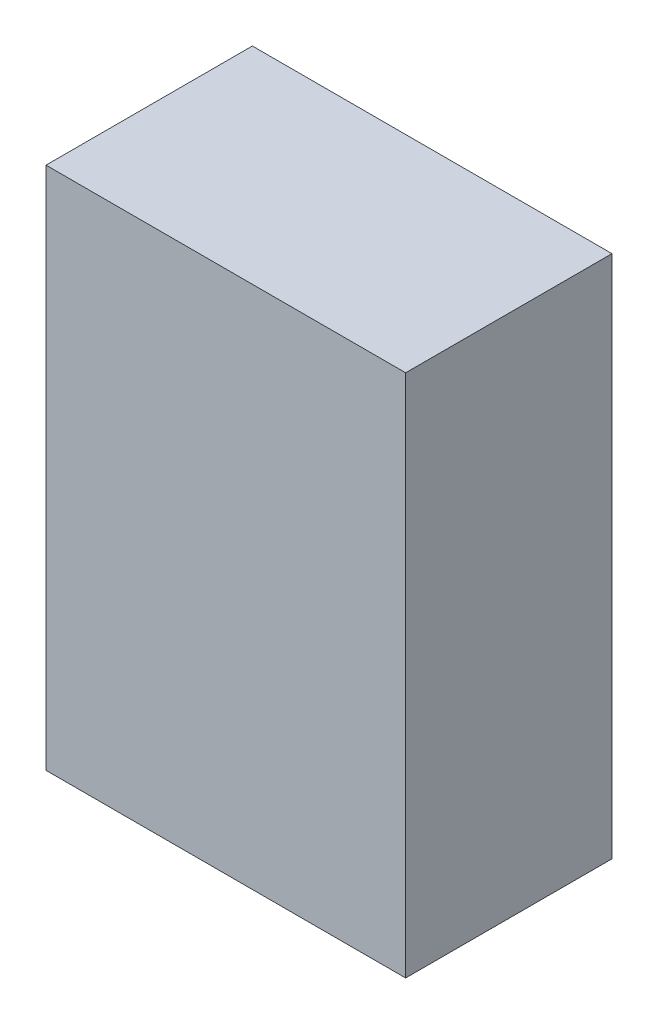
ISO-10303-21;
HEADER;
FILE_DESCRIPTION(('STEP AP214'),'2;1');
FILE_NAME('part.step','',(''),(''),'','','');
FILE_SCHEMA(('AUTOMOTIVE_DESIGN { 1 0 10303 214 1 1 1 1 }'));
ENDSEC;
DATA;
#1=APPLICATION_CONTEXT('core data for automotive mechanical design processes');
#2=APPLICATION_PROTOCOL_DEFINITION('international standard','automotive_design',2000,#1);
#3=PRODUCT_CONTEXT('',#1,'mechanical');
#4=PRODUCT('Part','Part','',(#3));
#5=PRODUCT_RELATED_PRODUCT_CATEGORY('part','',(#4));
#6=PRODUCT_DEFINITION_FORMATION('','',#4);
#7=PRODUCT_DEFINITION_CONTEXT('part definition',#1,'design');
#8=PRODUCT_DEFINITION('design','',#6,#7);
#9=PRODUCT_DEFINITION_SHAPE('','',#8);
#10=(LENGTH_UNIT() NAMED_UNIT(*) SI_UNIT(.MILLI.,.METRE.));
#11=(NAMED_UNIT(*) PLANE_ANGLE_UNIT() SI_UNIT($,.RADIAN.));
#12=(NAMED_UNIT(*) SI_UNIT($,.STERADIAN.) SOLID_ANGLE_UNIT());
#13=UNCERTAINTY_MEASURE_WITH_UNIT(LENGTH_MEASURE(1.E-05),#10,'distance_accuracy_value','');
#14=(GEOMETRIC_REPRESENTATION_CONTEXT(3) GLOBAL_UNCERTAINTY_ASSIGNED_CONTEXT((#13)) GLOBAL_UNIT_ASSIGNED_CONTEXT((#10,
#11,#12)) REPRESENTATION_CONTEXT('',''));
#15=CARTESIAN_POINT('',(0.,0.,0.));
#16=DIRECTION('',(0.,0.,1.));
#17=DIRECTION('',(1.,0.,0.));
#18=AXIS2_PLACEMENT_3D('',#15,#16,#17);
#19=CARTESIAN_POINT('',(29.785,9.,5.));
#20=DIRECTION('',(-1.,0.,0.));
#21=DIRECTION('',(0.,0.,1.));
#22=AXIS2_PLACEMENT_3D('',#19,#20,#21);
#23=PLANE('',#22);
#24=DIRECTION('',(0.,-1.,0.));
#25=VECTOR('',#24,1.);
#26=CARTESIAN_POINT('',(29.785,8.99999999999999,14.5));
#27=LINE('',#26,#25);
#28=CARTESIAN_POINT('',(29.785,1.50000000000001,14.5));
#29=VERTEX_POINT('',#28);
#30=CARTESIAN_POINT('',(29.785,0.,14.5));
#31=VERTEX_POINT('',#30);
#32=EDGE_CURVE('E56',#29,#31,#27,.T.);
#33=ORIENTED_EDGE('',*,*,#32,.F.);
#34=CARTESIAN_POINT('',(29.785,1.50000000000001,13.));
#35=DIRECTION('',(-1.,0.,0.));
#36=DIRECTION('',(0.,0.,1.));
#37=AXIS2_PLACEMENT_3D('',#34,#35,#36);
#38=CIRCLE('',#37,1.5);
#39=CARTESIAN_POINT('',(29.785,3.00000000000001,13.));
#40=VERTEX_POINT('',#39);
#41=EDGE_CURVE('E60',#40,#29,#38,.F.);
#42=ORIENTED_EDGE('',*,*,#41,.F.);
#43=DIRECTION('',(0.,0.,1.));
#44=VECTOR('',#43,1.);
#45=CARTESIAN_POINT('',(29.785,3.00000000000001,5.));
#46=LINE('',#45,#44);
#47=CARTESIAN_POINT('',(29.785,3.00000000000001,12.));
#48=VERTEX_POINT('',#47);
#49=EDGE_CURVE('E293',#48,#40,#46,.T.);
#50=ORIENTED_EDGE('',*,*,#49,.F.);
#51=CARTESIAN_POINT('',(29.785,1.50000000000001,12.));
#52=DIRECTION('',(-1.,0.,0.));
#53=DIRECTION('',(0.,0.,1.));
#54=AXIS2_PLACEMENT_3D('',#51,#52,#53);
#55=CIRCLE('',#54,1.5);
#56=CARTESIAN_POINT('',(29.785,1.50000000000001,10.5));
#57=VERTEX_POINT('',#56);
#58=EDGE_CURVE('E284',#57,#48,#55,.F.);
#59=ORIENTED_EDGE('',*,*,#58,.F.);
#60=DIRECTION('',(0.,1.,0.));
#61=VECTOR('',#60,1.);
#62=CARTESIAN_POINT('',(29.785,9.,10.5));
#63=LINE('',#62,#61);
#64=CARTESIAN_POINT('',(29.785,0.,10.5));
#65=VERTEX_POINT('',#64);
#66=EDGE_CURVE('E245',#65,#57,#63,.T.);
#67=ORIENTED_EDGE('',*,*,#66,.F.);
#68=DIRECTION('',(0.,0.,-1.));
#69=VECTOR('',#68,1.);
#70=CARTESIAN_POINT('',(29.785,0.,5.));
#71=LINE('',#70,#69);
#72=CARTESIAN_POINT('',(29.785,0.,7.5));
#73=VERTEX_POINT('',#72);
#74=EDGE_CURVE('E312',#65,#73,#71,.T.);
#75=ORIENTED_EDGE('',*,*,#74,.T.);
#76=DIRECTION('',(0.,1.,0.));
#77=VECTOR('',#76,1.);
#78=CARTESIAN_POINT('',(29.785,0.,7.5));
#79=LINE('',#78,#77);
#80=CARTESIAN_POINT('',(29.785,3.50000000000001,7.5));
#81=VERTEX_POINT('',#80);
#82=EDGE_CURVE('E414',#73,#81,#79,.T.);
#83=ORIENTED_EDGE('',*,*,#82,.T.);
#84=CARTESIAN_POINT('',(29.785,3.50000000000001,9.));
#85=DIRECTION('',(-1.,0.,0.));
#86=DIRECTION('',(0.,0.,1.));
#87=AXIS2_PLACEMENT_3D('',#84,#85,#86);
#88=CIRCLE('',#87,1.5);
#89=CARTESIAN_POINT('',(29.785,5.00000000000001,9.));
#90=VERTEX_POINT('',#89);
#91=EDGE_CURVE('E234',#81,#90,#88,.F.);
#92=ORIENTED_EDGE('',*,*,#91,.T.);
#93=DIRECTION('',(0.,0.,1.));
#94=VECTOR('',#93,1.);
#95=CARTESIAN_POINT('',(29.785,5.00000000000001,9.00000000000001));
#96=LINE('',#95,#94);
#97=CARTESIAN_POINT('',(29.785,5.00000000000001,16.));
#98=VERTEX_POINT('',#97);
#99=EDGE_CURVE('E319',#90,#98,#96,.T.);
#100=ORIENTED_EDGE('',*,*,#99,.T.);
#101=CARTESIAN_POINT('',(29.785,3.50000000000001,16.));
#102=DIRECTION('',(-1.,0.,0.));
#103=DIRECTION('',(0.,0.,1.));
#104=AXIS2_PLACEMENT_3D('',#101,#102,#103);
#105=CIRCLE('',#104,1.5);
#106=CARTESIAN_POINT('',(29.785,3.50000000000001,17.5));
#107=VERTEX_POINT('',#106);
#108=EDGE_CURVE('E322',#98,#107,#105,.F.);
#109=ORIENTED_EDGE('',*,*,#108,.T.);
#110=DIRECTION('',(0.,-1.,0.));
#111=VECTOR('',#110,1.);
#112=CARTESIAN_POINT('',(29.785,3.5,17.5));
#113=LINE('',#112,#111);
#114=CARTESIAN_POINT('',(29.785,0.,17.5));
#115=VERTEX_POINT('',#114);
#116=EDGE_CURVE('E325',#107,#115,#113,.T.);
#117=ORIENTED_EDGE('',*,*,#116,.T.);
#118=EDGE_CURVE('E313',#115,#31,#71,.T.);
#119=ORIENTED_EDGE('',*,*,#118,.T.);
#120=EDGE_LOOP('',(#33,#42,#50,#59,#67,#75,#83,#92,#100,#109,#117,#119));
#121=FACE_BOUND('',#120,.T.);
#122=ADVANCED_FACE('F41',(#121),#23,.F.);
#123=CARTESIAN_POINT('',(13.785,9.,5.));
#124=DIRECTION('',(1.,0.,0.));
#125=DIRECTION('',(0.,0.,-1.));
#126=AXIS2_PLACEMENT_3D('',#123,#124,#125);
#127=PLANE('',#126);
#128=DIRECTION('',(0.,1.,0.));
#129=VECTOR('',#128,1.);
#130=CARTESIAN_POINT('',(13.785,8.99999999999999,14.5));
#131=LINE('',#130,#129);
#132=CARTESIAN_POINT('',(13.785,0.,14.5));
#133=VERTEX_POINT('',#132);
#134=CARTESIAN_POINT('',(13.785,1.50000000000001,14.5));
#135=VERTEX_POINT('',#134);
#136=EDGE_CURVE('E305',#133,#135,#131,.T.);
#137=ORIENTED_EDGE('',*,*,#136,.F.);
#138=DIRECTION('',(0.,0.,1.));
#139=VECTOR('',#138,1.);
#140=CARTESIAN_POINT('',(13.785,0.,5.));
#141=LINE('',#140,#139);
#142=CARTESIAN_POINT('',(13.785,0.,17.5));
#143=VERTEX_POINT('',#142);
#144=EDGE_CURVE('E235',#133,#143,#141,.T.);
#145=ORIENTED_EDGE('',*,*,#144,.T.);
#146=DIRECTION('',(0.,1.,0.));
#147=VECTOR('',#146,1.);
#148=CARTESIAN_POINT('',(13.785,3.5,17.5));
#149=LINE('',#148,#147);
#150=CARTESIAN_POINT('',(13.785,3.5,17.5));
#151=VERTEX_POINT('',#150);
#152=EDGE_CURVE('E360',#143,#151,#149,.T.);
#153=ORIENTED_EDGE('',*,*,#152,.T.);
#154=CARTESIAN_POINT('',(13.785,3.5,16.));
#155=DIRECTION('',(1.,0.,0.));
#156=DIRECTION('',(0.,0.,-1.));
#157=AXIS2_PLACEMENT_3D('',#154,#155,#156);
#158=CIRCLE('',#157,1.5);
#159=CARTESIAN_POINT('',(13.785,5.,16.));
#160=VERTEX_POINT('',#159);
#161=EDGE_CURVE('E357',#151,#160,#158,.F.);
#162=ORIENTED_EDGE('',*,*,#161,.T.);
#163=DIRECTION('',(0.,0.,-1.));
#164=VECTOR('',#163,1.);
#165=CARTESIAN_POINT('',(13.785,5.,8.99999999999999));
#166=LINE('',#165,#164);
#167=CARTESIAN_POINT('',(13.785,5.,9.));
#168=VERTEX_POINT('',#167);
#169=EDGE_CURVE('E354',#160,#168,#166,.T.);
#170=ORIENTED_EDGE('',*,*,#169,.T.);
#171=CARTESIAN_POINT('',(13.785,3.5,9.));
#172=DIRECTION('',(1.,0.,0.));
#173=DIRECTION('',(0.,0.,-1.));
#174=AXIS2_PLACEMENT_3D('',#171,#172,#173);
#175=CIRCLE('',#174,1.5);
#176=CARTESIAN_POINT('',(13.785,3.5,7.5));
#177=VERTEX_POINT('',#176);
#178=EDGE_CURVE('E352',#168,#177,#175,.F.);
#179=ORIENTED_EDGE('',*,*,#178,.T.);
#180=DIRECTION('',(0.,-1.,0.));
#181=VECTOR('',#180,1.);
#182=CARTESIAN_POINT('',(13.785,0.,7.5));
#183=LINE('',#182,#181);
#184=CARTESIAN_POINT('',(13.785,0.,7.5));
#185=VERTEX_POINT('',#184);
#186=EDGE_CURVE('E230',#177,#185,#183,.T.);
#187=ORIENTED_EDGE('',*,*,#186,.T.);
#188=CARTESIAN_POINT('',(13.785,0.,10.5));
#189=VERTEX_POINT('',#188);
#190=EDGE_CURVE('E224',#185,#189,#141,.T.);
#191=ORIENTED_EDGE('',*,*,#190,.T.);
#192=DIRECTION('',(0.,-1.,0.));
#193=VECTOR('',#192,1.);
#194=CARTESIAN_POINT('',(13.785,9.,10.5));
#195=LINE('',#194,#193);
#196=CARTESIAN_POINT('',(13.785,1.50000000000001,10.5));
#197=VERTEX_POINT('',#196);
#198=EDGE_CURVE('E227',#197,#189,#195,.T.);
#199=ORIENTED_EDGE('',*,*,#198,.F.);
#200=CARTESIAN_POINT('',(13.785,1.5,12.));
#201=DIRECTION('',(1.,0.,0.));
#202=DIRECTION('',(0.,0.,-1.));
#203=AXIS2_PLACEMENT_3D('',#200,#201,#202);
#204=CIRCLE('',#203,1.5);
#205=CARTESIAN_POINT('',(13.785,3.,12.));
#206=VERTEX_POINT('',#205);
#207=EDGE_CURVE('E282',#206,#197,#204,.F.);
#208=ORIENTED_EDGE('',*,*,#207,.F.);
#209=DIRECTION('',(0.,0.,-1.));
#210=VECTOR('',#209,1.);
#211=CARTESIAN_POINT('',(13.785,3.,5.));
#212=LINE('',#211,#210);
#213=CARTESIAN_POINT('',(13.785,3.,13.));
#214=VERTEX_POINT('',#213);
#215=EDGE_CURVE('E290',#214,#206,#212,.T.);
#216=ORIENTED_EDGE('',*,*,#215,.F.);
#217=CARTESIAN_POINT('',(13.785,1.5,13.));
#218=DIRECTION('',(1.,0.,0.));
#219=DIRECTION('',(0.,0.,-1.));
#220=AXIS2_PLACEMENT_3D('',#217,#218,#219);
#221=CIRCLE('',#220,1.5);
#222=EDGE_CURVE('E298',#135,#214,#221,.F.);
#223=ORIENTED_EDGE('',*,*,#222,.F.);
#224=EDGE_LOOP('',(#137,#145,#153,#162,#170,#179,#187,#191,#199,#208,#216,#223));
#225=FACE_BOUND('',#224,.T.);
#226=ADVANCED_FACE('F226',(#225),#127,.F.);
#227=CARTESIAN_POINT('',(35.785,9.,20.));
#228=DIRECTION('',(1.,0.,0.));
#229=DIRECTION('',(0.,0.,-1.));
#230=AXIS2_PLACEMENT_3D('',#227,#228,#229);
#231=PLANE('',#230);
#232=DIRECTION('',(0.,1.,0.));
#233=VECTOR('',#232,1.);
#234=CARTESIAN_POINT('',(35.785,9.00000000000001,14.5));
#235=LINE('',#234,#233);
#236=CARTESIAN_POINT('',(35.785,0.,14.5));
#237=VERTEX_POINT('',#236);
#238=CARTESIAN_POINT('',(35.785,1.50000000000001,14.5));
#239=VERTEX_POINT('',#238);
#240=EDGE_CURVE('E302',#237,#239,#235,.T.);
#241=ORIENTED_EDGE('',*,*,#240,.F.);
#242=DIRECTION('',(0.,0.,1.));
#243=VECTOR('',#242,1.);
#244=CARTESIAN_POINT('',(35.785,0.,20.));
#245=LINE('',#244,#243);
#246=CARTESIAN_POINT('',(35.785,0.,17.5));
#247=VERTEX_POINT('',#246);
#248=EDGE_CURVE('E309',#237,#247,#245,.T.);
#249=ORIENTED_EDGE('',*,*,#248,.T.);
#250=DIRECTION('',(0.,1.,0.));
#251=VECTOR('',#250,1.);
#252=CARTESIAN_POINT('',(35.785,3.5,17.5));
#253=LINE('',#252,#251);
#254=CARTESIAN_POINT('',(35.785,3.50000000000001,17.5));
#255=VERTEX_POINT('',#254);
#256=EDGE_CURVE('E337',#247,#255,#253,.T.);
#257=ORIENTED_EDGE('',*,*,#256,.T.);
#258=CARTESIAN_POINT('',(35.785,3.50000000000001,16.));
#259=DIRECTION('',(1.,0.,0.));
#260=DIRECTION('',(0.,0.,-1.));
#261=AXIS2_PLACEMENT_3D('',#258,#259,#260);
#262=CIRCLE('',#261,1.5);
#263=CARTESIAN_POINT('',(35.785,5.00000000000001,16.));
#264=VERTEX_POINT('',#263);
#265=EDGE_CURVE('E334',#255,#264,#262,.F.);
#266=ORIENTED_EDGE('',*,*,#265,.T.);
#267=DIRECTION('',(0.,0.,-1.));
#268=VECTOR('',#267,1.);
#269=CARTESIAN_POINT('',(35.785,5.00000000000001,9.));
#270=LINE('',#269,#268);
#271=CARTESIAN_POINT('',(35.785,5.00000000000001,9.));
#272=VERTEX_POINT('',#271);
#273=EDGE_CURVE('E331',#264,#272,#270,.T.);
#274=ORIENTED_EDGE('',*,*,#273,.T.);
#275=CARTESIAN_POINT('',(35.785,3.50000000000001,9.));
#276=DIRECTION('',(1.,0.,0.));
#277=DIRECTION('',(0.,0.,-1.));
#278=AXIS2_PLACEMENT_3D('',#275,#276,#277);
#279=CIRCLE('',#278,1.5);
#280=CARTESIAN_POINT('',(35.785,3.50000000000001,7.5));
#281=VERTEX_POINT('',#280);
#282=EDGE_CURVE('E328',#272,#281,#279,.F.);
#283=ORIENTED_EDGE('',*,*,#282,.T.);
#284=DIRECTION('',(0.,-1.,0.));
#285=VECTOR('',#284,1.);
#286=CARTESIAN_POINT('',(35.785,0.,7.5));
#287=LINE('',#286,#285);
#288=CARTESIAN_POINT('',(35.785,0.,7.5));
#289=VERTEX_POINT('',#288);
#290=EDGE_CURVE('E417',#281,#289,#287,.T.);
#291=ORIENTED_EDGE('',*,*,#290,.T.);
#292=CARTESIAN_POINT('',(35.785,0.,10.5));
#293=VERTEX_POINT('',#292);
#294=EDGE_CURVE('E310',#289,#293,#245,.T.);
#295=ORIENTED_EDGE('',*,*,#294,.T.);
#296=DIRECTION('',(0.,-1.,0.));
#297=VECTOR('',#296,1.);
#298=CARTESIAN_POINT('',(35.785,9.,10.5));
#299=LINE('',#298,#297);
#300=CARTESIAN_POINT('',(35.785,1.50000000000001,10.5));
#301=VERTEX_POINT('',#300);
#302=EDGE_CURVE('E246',#301,#293,#299,.T.);
#303=ORIENTED_EDGE('',*,*,#302,.F.);
#304=CARTESIAN_POINT('',(35.785,1.50000000000001,12.));
#305=DIRECTION('',(1.,0.,0.));
#306=DIRECTION('',(0.,0.,-1.));
#307=AXIS2_PLACEMENT_3D('',#304,#305,#306);
#308=CIRCLE('',#307,1.5);
#309=CARTESIAN_POINT('',(35.785,3.00000000000001,12.));
#310=VERTEX_POINT('',#309);
#311=EDGE_CURVE('E279',#310,#301,#308,.F.);
#312=ORIENTED_EDGE('',*,*,#311,.F.);
#313=DIRECTION('',(0.,0.,-1.));
#314=VECTOR('',#313,1.);
#315=CARTESIAN_POINT('',(35.785,3.00000000000001,20.));
#316=LINE('',#315,#314);
#317=CARTESIAN_POINT('',(35.785,3.00000000000001,13.));
#318=VERTEX_POINT('',#317);
#319=EDGE_CURVE('E287',#318,#310,#316,.T.);
#320=ORIENTED_EDGE('',*,*,#319,.F.);
#321=CARTESIAN_POINT('',(35.785,1.50000000000001,13.));
#322=DIRECTION('',(1.,0.,0.));
#323=DIRECTION('',(0.,0.,-1.));
#324=AXIS2_PLACEMENT_3D('',#321,#322,#323);
#325=CIRCLE('',#324,1.5);
#326=EDGE_CURVE('E295',#239,#318,#325,.F.);
#327=ORIENTED_EDGE('',*,*,#326,.F.);
#328=EDGE_LOOP('',(#241,#249,#257,#266,#274,#283,#291,#295,#303,#312,#320,#327));
#329=FACE_BOUND('',#328,.T.);
#330=ADVANCED_FACE('F492',(#329),#231,.F.);
#331=CARTESIAN_POINT('',(7.785,9.,20.));
#332=DIRECTION('',(-1.,0.,0.));
#333=DIRECTION('',(0.,0.,1.));
#334=AXIS2_PLACEMENT_3D('',#331,#332,#333);
#335=PLANE('',#334);
#336=DIRECTION('',(0.,-1.,0.));
#337=VECTOR('',#336,1.);
#338=CARTESIAN_POINT('',(7.785,9.00000000000001,14.5));
#339=LINE('',#338,#337);
#340=CARTESIAN_POINT('',(7.785,1.5,14.5));
#341=VERTEX_POINT('',#340);
#342=CARTESIAN_POINT('',(7.785,0.,14.5));
#343=VERTEX_POINT('',#342);
#344=EDGE_CURVE('E11',#341,#343,#339,.T.);
#345=ORIENTED_EDGE('',*,*,#344,.F.);
#346=CARTESIAN_POINT('',(7.785,1.5,13.));
#347=DIRECTION('',(-1.,0.,0.));
#348=DIRECTION('',(0.,0.,1.));
#349=AXIS2_PLACEMENT_3D('',#346,#347,#348);
#350=CIRCLE('',#349,1.5);
#351=CARTESIAN_POINT('',(7.785,3.,13.));
#352=VERTEX_POINT('',#351);
#353=EDGE_CURVE('E49',#352,#341,#350,.F.);
#354=ORIENTED_EDGE('',*,*,#353,.F.);
#355=DIRECTION('',(0.,0.,1.));
#356=VECTOR('',#355,1.);
#357=CARTESIAN_POINT('',(7.785,3.,20.));
#358=LINE('',#357,#356);
#359=CARTESIAN_POINT('',(7.785,3.,12.));
#360=VERTEX_POINT('',#359);
#361=EDGE_CURVE('E429',#360,#352,#358,.T.);
#362=ORIENTED_EDGE('',*,*,#361,.F.);
#363=CARTESIAN_POINT('',(7.785,1.5,12.));
#364=DIRECTION('',(-1.,0.,0.));
#365=DIRECTION('',(0.,0.,1.));
#366=AXIS2_PLACEMENT_3D('',#363,#364,#365);
#367=CIRCLE('',#366,1.5);
#368=CARTESIAN_POINT('',(7.785,1.5,10.5));
#369=VERTEX_POINT('',#368);
#370=EDGE_CURVE('E426',#369,#360,#367,.F.);
#371=ORIENTED_EDGE('',*,*,#370,.F.);
#372=DIRECTION('',(0.,1.,0.));
#373=VECTOR('',#372,1.);
#374=CARTESIAN_POINT('',(7.785,9.,10.5));
#375=LINE('',#374,#373);
#376=CARTESIAN_POINT('',(7.785,0.,10.5));
#377=VERTEX_POINT('',#376);
#378=EDGE_CURVE('E424',#377,#369,#375,.T.);
#379=ORIENTED_EDGE('',*,*,#378,.F.);
#380=DIRECTION('',(0.,0.,-1.));
#381=VECTOR('',#380,1.);
#382=CARTESIAN_POINT('',(7.785,0.,20.));
#383=LINE('',#382,#381);
#384=CARTESIAN_POINT('',(7.785,0.,7.5));
#385=VERTEX_POINT('',#384);
#386=EDGE_CURVE('E251',#377,#385,#383,.T.);
#387=ORIENTED_EDGE('',*,*,#386,.T.);
#388=DIRECTION('',(0.,1.,0.));
#389=VECTOR('',#388,1.);
#390=CARTESIAN_POINT('',(7.785,0.,7.5));
#391=LINE('',#390,#389);
#392=CARTESIAN_POINT('',(7.785,3.50000000000001,7.5));
#393=VERTEX_POINT('',#392);
#394=EDGE_CURVE('E420',#385,#393,#391,.T.);
#395=ORIENTED_EDGE('',*,*,#394,.T.);
#396=CARTESIAN_POINT('',(7.785,3.5,9.));
#397=DIRECTION('',(-1.,0.,0.));
#398=DIRECTION('',(0.,0.,1.));
#399=AXIS2_PLACEMENT_3D('',#396,#397,#398);
#400=CIRCLE('',#399,1.5);
#401=CARTESIAN_POINT('',(7.785,5.,9.));
#402=VERTEX_POINT('',#401);
#403=EDGE_CURVE('E340',#393,#402,#400,.F.);
#404=ORIENTED_EDGE('',*,*,#403,.T.);
#405=DIRECTION('',(0.,0.,1.));
#406=VECTOR('',#405,1.);
#407=CARTESIAN_POINT('',(7.785,5.,9.));
#408=LINE('',#407,#406);
#409=CARTESIAN_POINT('',(7.785,5.,16.));
#410=VERTEX_POINT('',#409);
#411=EDGE_CURVE('E343',#402,#410,#408,.T.);
#412=ORIENTED_EDGE('',*,*,#411,.T.);
#413=CARTESIAN_POINT('',(7.785,3.5,16.));
#414=DIRECTION('',(-1.,0.,0.));
#415=DIRECTION('',(0.,0.,1.));
#416=AXIS2_PLACEMENT_3D('',#413,#414,#415);
#417=CIRCLE('',#416,1.5);
#418=CARTESIAN_POINT('',(7.785,3.5,17.5));
#419=VERTEX_POINT('',#418);
#420=EDGE_CURVE('E346',#410,#419,#417,.F.);
#421=ORIENTED_EDGE('',*,*,#420,.T.);
#422=DIRECTION('',(0.,-1.,0.));
#423=VECTOR('',#422,1.);
#424=CARTESIAN_POINT('',(7.785,3.5,17.5));
#425=LINE('',#424,#423);
#426=CARTESIAN_POINT('',(7.785,0.,17.5));
#427=VERTEX_POINT('',#426);
#428=EDGE_CURVE('E349',#419,#427,#425,.T.);
#429=ORIENTED_EDGE('',*,*,#428,.T.);
#430=EDGE_CURVE('E315',#427,#343,#383,.T.);
#431=ORIENTED_EDGE('',*,*,#430,.T.);
#432=EDGE_LOOP('',(#345,#354,#362,#371,#379,#387,#395,#404,#412,#421,#429,#431));
#433=FACE_BOUND('',#432,.T.);
#434=ADVANCED_FACE('F452',(#433),#335,.F.);
#435=CARTESIAN_POINT('',(0.,3.5,17.5));
#436=DIRECTION('',(0.,0.,1.));
#437=DIRECTION('',(0.,-1.,0.));
#438=AXIS2_PLACEMENT_3D('',#435,#436,#437);
#439=PLANE('',#438);
#440=ORIENTED_EDGE('',*,*,#152,.F.);
#441=DIRECTION('',(1.,0.,0.));
#442=VECTOR('',#441,1.);
#443=CARTESIAN_POINT('',(0.,0.,17.5));
#444=LINE('',#443,#442);
#445=EDGE_CURVE('E411',#427,#143,#444,.T.);
#446=ORIENTED_EDGE('',*,*,#445,.F.);
#447=ORIENTED_EDGE('',*,*,#428,.F.);
#448=DIRECTION('',(1.,0.,0.));
#449=VECTOR('',#448,1.);
#450=CARTESIAN_POINT('',(0.,3.5,17.5));
#451=LINE('',#450,#449);
#452=EDGE_CURVE('E406',#419,#151,#451,.T.);
#453=ORIENTED_EDGE('',*,*,#452,.T.);
#454=EDGE_LOOP('',(#440,#446,#447,#453));
#455=FACE_BOUND('',#454,.T.);
#456=ADVANCED_FACE('F449',(#455),#439,.F.);
#457=ORIENTED_EDGE('',*,*,#256,.F.);
#458=EDGE_CURVE('E379',#115,#247,#444,.T.);
#459=ORIENTED_EDGE('',*,*,#458,.F.);
#460=ORIENTED_EDGE('',*,*,#116,.F.);
#461=EDGE_CURVE('E385',#107,#255,#451,.T.);
#462=ORIENTED_EDGE('',*,*,#461,.T.);
#463=EDGE_LOOP('',(#457,#459,#460,#462));
#464=FACE_BOUND('',#463,.T.);
#465=ADVANCED_FACE('F527',(#464),#439,.F.);
#466=CARTESIAN_POINT('',(0.,3.5,16.));
#467=DIRECTION('',(1.,0.,0.));
#468=DIRECTION('',(0.,1.,0.));
#469=AXIS2_PLACEMENT_3D('',#466,#467,#468);
#470=CYLINDRICAL_SURFACE('',#469,1.5);
#471=ORIENTED_EDGE('',*,*,#161,.F.);
#472=ORIENTED_EDGE('',*,*,#452,.F.);
#473=ORIENTED_EDGE('',*,*,#420,.F.);
#474=DIRECTION('',(1.,0.,0.));
#475=VECTOR('',#474,1.);
#476=CARTESIAN_POINT('',(0.,5.,16.));
#477=LINE('',#476,#475);
#478=EDGE_CURVE('E402',#410,#160,#477,.T.);
#479=ORIENTED_EDGE('',*,*,#478,.T.);
#480=EDGE_LOOP('',(#471,#472,#473,#479));
#481=FACE_BOUND('',#480,.T.);
#482=ADVANCED_FACE('F456',(#481),#470,.F.);
#483=ORIENTED_EDGE('',*,*,#265,.F.);
#484=ORIENTED_EDGE('',*,*,#461,.F.);
#485=ORIENTED_EDGE('',*,*,#108,.F.);
#486=EDGE_CURVE('E403',#98,#264,#477,.T.);
#487=ORIENTED_EDGE('',*,*,#486,.T.);
#488=EDGE_LOOP('',(#483,#484,#485,#487));
#489=FACE_BOUND('',#488,.T.);
#490=ADVANCED_FACE('F524',(#489),#470,.F.);
#491=CARTESIAN_POINT('',(0.,5.,9.));
#492=DIRECTION('',(0.,1.,0.));
#493=DIRECTION('',(-1.,0.,0.));
#494=AXIS2_PLACEMENT_3D('',#491,#492,#493);
#495=PLANE('',#494);
#496=ORIENTED_EDGE('',*,*,#169,.F.);
#497=ORIENTED_EDGE('',*,*,#478,.F.);
#498=ORIENTED_EDGE('',*,*,#411,.F.);
#499=DIRECTION('',(1.,0.,0.));
#500=VECTOR('',#499,1.);
#501=CARTESIAN_POINT('',(0.,5.,9.));
#502=LINE('',#501,#500);
#503=EDGE_CURVE('E398',#402,#168,#502,.T.);
#504=ORIENTED_EDGE('',*,*,#503,.T.);
#505=EDGE_LOOP('',(#496,#497,#498,#504));
#506=FACE_BOUND('',#505,.T.);
#507=ADVANCED_FACE('F458',(#506),#495,.F.);
#508=ORIENTED_EDGE('',*,*,#273,.F.);
#509=ORIENTED_EDGE('',*,*,#486,.F.);
#510=ORIENTED_EDGE('',*,*,#99,.F.);
#511=EDGE_CURVE('E399',#90,#272,#502,.T.);
#512=ORIENTED_EDGE('',*,*,#511,.T.);
#513=EDGE_LOOP('',(#508,#509,#510,#512));
#514=FACE_BOUND('',#513,.T.);
#515=ADVANCED_FACE('F521',(#514),#495,.F.);
#516=CARTESIAN_POINT('',(0.,3.5,9.));
#517=DIRECTION('',(1.,0.,0.));
#518=DIRECTION('',(0.,1.,0.));
#519=AXIS2_PLACEMENT_3D('',#516,#517,#518);
#520=CYLINDRICAL_SURFACE('',#519,1.5);
#521=ORIENTED_EDGE('',*,*,#178,.F.);
#522=ORIENTED_EDGE('',*,*,#503,.F.);
#523=ORIENTED_EDGE('',*,*,#403,.F.);
#524=DIRECTION('',(1.,0.,0.));
#525=VECTOR('',#524,1.);
#526=CARTESIAN_POINT('',(0.,3.5,7.5));
#527=LINE('',#526,#525);
#528=EDGE_CURVE('E394',#393,#177,#527,.T.);
#529=ORIENTED_EDGE('',*,*,#528,.T.);
#530=EDGE_LOOP('',(#521,#522,#523,#529));
#531=FACE_BOUND('',#530,.T.);
#532=ADVANCED_FACE('F463',(#531),#520,.F.);
#533=ORIENTED_EDGE('',*,*,#282,.F.);
#534=ORIENTED_EDGE('',*,*,#511,.F.);
#535=ORIENTED_EDGE('',*,*,#91,.F.);
#536=EDGE_CURVE('E395',#81,#281,#527,.T.);
#537=ORIENTED_EDGE('',*,*,#536,.T.);
#538=EDGE_LOOP('',(#533,#534,#535,#537));
#539=FACE_BOUND('',#538,.T.);
#540=ADVANCED_FACE('F518',(#539),#520,.F.);
#541=CARTESIAN_POINT('',(0.,0.,7.5));
#542=DIRECTION('',(0.,0.,-1.));
#543=DIRECTION('',(0.,1.,0.));
#544=AXIS2_PLACEMENT_3D('',#541,#542,#543);
#545=PLANE('',#544);
#546=ORIENTED_EDGE('',*,*,#186,.F.);
#547=ORIENTED_EDGE('',*,*,#528,.F.);
#548=ORIENTED_EDGE('',*,*,#394,.F.);
#549=DIRECTION('',(1.,0.,0.));
#550=VECTOR('',#549,1.);
#551=CARTESIAN_POINT('',(0.,0.,7.5));
#552=LINE('',#551,#550);
#553=EDGE_CURVE('E393',#385,#185,#552,.T.);
#554=ORIENTED_EDGE('',*,*,#553,.T.);
#555=EDGE_LOOP('',(#546,#547,#548,#554));
#556=FACE_BOUND('',#555,.T.);
#557=ADVANCED_FACE('F467',(#556),#545,.F.);
#558=ORIENTED_EDGE('',*,*,#290,.F.);
#559=ORIENTED_EDGE('',*,*,#536,.F.);
#560=ORIENTED_EDGE('',*,*,#82,.F.);
#561=EDGE_CURVE('E391',#73,#289,#552,.T.);
#562=ORIENTED_EDGE('',*,*,#561,.T.);
#563=EDGE_LOOP('',(#558,#559,#560,#562));
#564=FACE_BOUND('',#563,.T.);
#565=ADVANCED_FACE('F517',(#564),#545,.F.);
#566=CARTESIAN_POINT('',(0.,0.,25.));
#567=DIRECTION('',(1.,0.,0.));
#568=DIRECTION('',(0.,1.,0.));
#569=AXIS2_PLACEMENT_3D('',#566,#567,#568);
#570=PLANE('',#569);
#571=DIRECTION('',(0.,-1.,0.));
#572=VECTOR('',#571,1.);
#573=CARTESIAN_POINT('',(0.,0.,0.));
#574=LINE('',#573,#572);
#575=CARTESIAN_POINT('',(0.,63.5,0.));
#576=VERTEX_POINT('',#575);
#577=CARTESIAN_POINT('',(0.,0.,0.));
#578=VERTEX_POINT('',#577);
#579=EDGE_CURVE('E371',#576,#578,#574,.T.);
#580=ORIENTED_EDGE('',*,*,#579,.T.);
#581=DIRECTION('',(0.,0.,-1.));
#582=VECTOR('',#581,1.);
#583=CARTESIAN_POINT('',(0.,0.,25.));
#584=LINE('',#583,#582);
#585=CARTESIAN_POINT('',(0.,0.,25.));
#586=VERTEX_POINT('',#585);
#587=EDGE_CURVE('E380',#586,#578,#584,.T.);
#588=ORIENTED_EDGE('',*,*,#587,.F.);
#589=DIRECTION('',(0.,-1.,0.));
#590=VECTOR('',#589,1.);
#591=CARTESIAN_POINT('',(0.,0.,25.));
#592=LINE('',#591,#590);
#593=CARTESIAN_POINT('',(0.,63.5,25.));
#594=VERTEX_POINT('',#593);
#595=EDGE_CURVE('E367',#594,#586,#592,.T.);
#596=ORIENTED_EDGE('',*,*,#595,.F.);
#597=DIRECTION('',(0.,0.,-1.));
#598=VECTOR('',#597,1.);
#599=CARTESIAN_POINT('',(0.,63.5,25.));
#600=LINE('',#599,#598);
#601=EDGE_CURVE('E363',#594,#576,#600,.T.);
#602=ORIENTED_EDGE('',*,*,#601,.T.);
#603=EDGE_LOOP('',(#580,#588,#596,#602));
#604=FACE_BOUND('',#603,.T.);
#605=ADVANCED_FACE('F43',(#604),#570,.F.);
#606=CARTESIAN_POINT('',(0.,0.,25.));
#607=DIRECTION('',(0.,1.,0.));
#608=DIRECTION('',(0.,0.,1.));
#609=AXIS2_PLACEMENT_3D('',#606,#607,#608);
#610=PLANE('',#609);
#611=ORIENTED_EDGE('',*,*,#248,.F.);
#612=DIRECTION('',(1.,0.,0.));
#613=VECTOR('',#612,1.);
#614=CARTESIAN_POINT('',(0.,0.,14.5));
#615=LINE('',#614,#613);
#616=EDGE_CURVE('E274',#31,#237,#615,.T.);
#617=ORIENTED_EDGE('',*,*,#616,.F.);
#618=ORIENTED_EDGE('',*,*,#118,.F.);
#619=ORIENTED_EDGE('',*,*,#458,.T.);
#620=EDGE_LOOP('',(#611,#617,#618,#619));
#621=FACE_BOUND('',#620,.T.);
#622=ORIENTED_EDGE('',*,*,#144,.F.);
#623=EDGE_CURVE('E273',#343,#133,#615,.T.);
#624=ORIENTED_EDGE('',*,*,#623,.F.);
#625=ORIENTED_EDGE('',*,*,#430,.F.);
#626=ORIENTED_EDGE('',*,*,#445,.T.);
#627=EDGE_LOOP('',(#622,#624,#625,#626));
#628=FACE_BOUND('',#627,.T.);
#629=ORIENTED_EDGE('',*,*,#386,.F.);
#630=DIRECTION('',(1.,0.,0.));
#631=VECTOR('',#630,1.);
#632=CARTESIAN_POINT('',(0.,0.,10.5));
#633=LINE('',#632,#631);
#634=EDGE_CURVE('E242',#377,#189,#633,.T.);
#635=ORIENTED_EDGE('',*,*,#634,.T.);
#636=ORIENTED_EDGE('',*,*,#190,.F.);
#637=ORIENTED_EDGE('',*,*,#553,.F.);
#638=EDGE_LOOP('',(#629,#635,#636,#637));
#639=FACE_BOUND('',#638,.T.);
#640=ORIENTED_EDGE('',*,*,#74,.F.);
#641=EDGE_CURVE('E252',#65,#293,#633,.T.);
#642=ORIENTED_EDGE('',*,*,#641,.T.);
#643=ORIENTED_EDGE('',*,*,#294,.F.);
#644=ORIENTED_EDGE('',*,*,#561,.F.);
#645=EDGE_LOOP('',(#640,#642,#643,#644));
#646=FACE_BOUND('',#645,.T.);
#647=ORIENTED_EDGE('',*,*,#587,.T.);
#648=DIRECTION('',(1.,0.,0.));
#649=VECTOR('',#648,1.);
#650=CARTESIAN_POINT('',(0.,0.,0.));
#651=LINE('',#650,#649);
#652=CARTESIAN_POINT('',(43.57,0.,0.));
#653=VERTEX_POINT('',#652);
#654=EDGE_CURVE('E376',#578,#653,#651,.T.);
#655=ORIENTED_EDGE('',*,*,#654,.T.);
#656=DIRECTION('',(0.,0.,-1.));
#657=VECTOR('',#656,1.);
#658=CARTESIAN_POINT('',(43.57,0.,25.));
#659=LINE('',#658,#657);
#660=CARTESIAN_POINT('',(43.57,0.,25.));
#661=VERTEX_POINT('',#660);
#662=EDGE_CURVE('E375',#661,#653,#659,.T.);
#663=ORIENTED_EDGE('',*,*,#662,.F.);
#664=DIRECTION('',(1.,0.,0.));
#665=VECTOR('',#664,1.);
#666=CARTESIAN_POINT('',(0.,0.,25.));
#667=LINE('',#666,#665);
#668=EDGE_CURVE('E388',#586,#661,#667,.T.);
#669=ORIENTED_EDGE('',*,*,#668,.F.);
#670=EDGE_LOOP('',(#647,#655,#663,#669));
#671=FACE_BOUND('',#670,.T.);
#672=ADVANCED_FACE('F249',(#621,#628,#639,#646,#671),#610,.F.);
#673=CARTESIAN_POINT('',(43.57,0.,25.));
#674=DIRECTION('',(-1.,0.,0.));
#675=DIRECTION('',(0.,-1.,0.));
#676=AXIS2_PLACEMENT_3D('',#673,#674,#675);
#677=PLANE('',#676);
#678=ORIENTED_EDGE('',*,*,#662,.T.);
#679=DIRECTION('',(0.,1.,0.));
#680=VECTOR('',#679,1.);
#681=CARTESIAN_POINT('',(43.57,0.,0.));
#682=LINE('',#681,#680);
#683=CARTESIAN_POINT('',(43.57,63.5,0.));
#684=VERTEX_POINT('',#683);
#685=EDGE_CURVE('E373',#653,#684,#682,.T.);
#686=ORIENTED_EDGE('',*,*,#685,.T.);
#687=DIRECTION('',(0.,0.,-1.));
#688=VECTOR('',#687,1.);
#689=CARTESIAN_POINT('',(43.57,63.5,25.));
#690=LINE('',#689,#688);
#691=CARTESIAN_POINT('',(43.57,63.5,25.));
#692=VERTEX_POINT('',#691);
#693=EDGE_CURVE('E364',#692,#684,#690,.T.);
#694=ORIENTED_EDGE('',*,*,#693,.F.);
#695=DIRECTION('',(0.,1.,0.));
#696=VECTOR('',#695,1.);
#697=CARTESIAN_POINT('',(43.57,0.,25.));
#698=LINE('',#697,#696);
#699=EDGE_CURVE('E386',#661,#692,#698,.T.);
#700=ORIENTED_EDGE('',*,*,#699,.F.);
#701=EDGE_LOOP('',(#678,#686,#694,#700));
#702=FACE_BOUND('',#701,.T.);
#703=ADVANCED_FACE('F506',(#702),#677,.F.);
#704=CARTESIAN_POINT('',(0.,63.5,25.));
#705=DIRECTION('',(0.,-1.,0.));
#706=DIRECTION('',(0.,0.,-1.));
#707=AXIS2_PLACEMENT_3D('',#704,#705,#706);
#708=PLANE('',#707);
#709=DIRECTION('',(-1.,0.,0.));
#710=VECTOR('',#709,1.);
#711=CARTESIAN_POINT('',(0.,63.5,0.));
#712=LINE('',#711,#710);
#713=EDGE_CURVE('E368',#684,#576,#712,.T.);
#714=ORIENTED_EDGE('',*,*,#713,.T.);
#715=ORIENTED_EDGE('',*,*,#601,.F.);
#716=DIRECTION('',(-1.,0.,0.));
#717=VECTOR('',#716,1.);
#718=CARTESIAN_POINT('',(0.,63.5,25.));
#719=LINE('',#718,#717);
#720=EDGE_CURVE('E383',#692,#594,#719,.T.);
#721=ORIENTED_EDGE('',*,*,#720,.F.);
#722=ORIENTED_EDGE('',*,*,#693,.T.);
#723=EDGE_LOOP('',(#714,#715,#721,#722));
#724=FACE_BOUND('',#723,.T.);
#725=ADVANCED_FACE('F502',(#724),#708,.F.);
#726=CARTESIAN_POINT('',(0.,0.,25.));
#727=DIRECTION('',(0.,0.,-1.));
#728=DIRECTION('',(-1.,0.,0.));
#729=AXIS2_PLACEMENT_3D('',#726,#727,#728);
#730=PLANE('',#729);
#731=ORIENTED_EDGE('',*,*,#699,.T.);
#732=ORIENTED_EDGE('',*,*,#720,.T.);
#733=ORIENTED_EDGE('',*,*,#595,.T.);
#734=ORIENTED_EDGE('',*,*,#668,.T.);
#735=EDGE_LOOP('',(#731,#732,#733,#734));
#736=FACE_BOUND('',#735,.T.);
#737=ADVANCED_FACE('F505',(#736),#730,.F.);
#738=CARTESIAN_POINT('',(0.,0.,0.));
#739=DIRECTION('',(0.,0.,-1.));
#740=DIRECTION('',(-1.,0.,0.));
#741=AXIS2_PLACEMENT_3D('',#738,#739,#740);
#742=PLANE('',#741);
#743=ORIENTED_EDGE('',*,*,#654,.F.);
#744=ORIENTED_EDGE('',*,*,#579,.F.);
#745=ORIENTED_EDGE('',*,*,#713,.F.);
#746=ORIENTED_EDGE('',*,*,#685,.F.);
#747=EDGE_LOOP('',(#743,#744,#745,#746));
#748=FACE_BOUND('',#747,.T.);
#749=ADVANCED_FACE('F508',(#748),#742,.T.);
#750=CARTESIAN_POINT('',(0.,1.5,10.5));
#751=DIRECTION('',(0.,0.,1.));
#752=DIRECTION('',(1.,0.,0.));
#753=AXIS2_PLACEMENT_3D('',#750,#751,#752);
#754=PLANE('',#753);
#755=DIRECTION('',(1.,0.,0.));
#756=VECTOR('',#755,1.);
#757=CARTESIAN_POINT('',(0.,1.5,10.5));
#758=LINE('',#757,#756);
#759=EDGE_CURVE('E244',#369,#197,#758,.T.);
#760=ORIENTED_EDGE('',*,*,#759,.T.);
#761=ORIENTED_EDGE('',*,*,#198,.T.);
#762=ORIENTED_EDGE('',*,*,#634,.F.);
#763=ORIENTED_EDGE('',*,*,#378,.T.);
#764=EDGE_LOOP('',(#760,#761,#762,#763));
#765=FACE_BOUND('',#764,.T.);
#766=ADVANCED_FACE('F240',(#765),#754,.F.);
#767=CARTESIAN_POINT('',(0.,1.5,12.));
#768=DIRECTION('',(1.,0.,0.));
#769=DIRECTION('',(0.,1.,0.));
#770=AXIS2_PLACEMENT_3D('',#767,#768,#769);
#771=CYLINDRICAL_SURFACE('',#770,1.5);
#772=DIRECTION('',(1.,0.,0.));
#773=VECTOR('',#772,1.);
#774=CARTESIAN_POINT('',(0.,3.,12.));
#775=LINE('',#774,#773);
#776=EDGE_CURVE('E261',#360,#206,#775,.T.);
#777=ORIENTED_EDGE('',*,*,#776,.T.);
#778=ORIENTED_EDGE('',*,*,#207,.T.);
#779=ORIENTED_EDGE('',*,*,#759,.F.);
#780=ORIENTED_EDGE('',*,*,#370,.T.);
#781=EDGE_LOOP('',(#777,#778,#779,#780));
#782=FACE_BOUND('',#781,.T.);
#783=ADVANCED_FACE('F470',(#782),#771,.T.);
#784=CARTESIAN_POINT('',(0.,3.,13.));
#785=DIRECTION('',(0.,-1.,0.));
#786=DIRECTION('',(1.,0.,0.));
#787=AXIS2_PLACEMENT_3D('',#784,#785,#786);
#788=PLANE('',#787);
#789=DIRECTION('',(1.,0.,0.));
#790=VECTOR('',#789,1.);
#791=CARTESIAN_POINT('',(0.,3.,13.));
#792=LINE('',#791,#790);
#793=EDGE_CURVE('E265',#352,#214,#792,.T.);
#794=ORIENTED_EDGE('',*,*,#793,.T.);
#795=ORIENTED_EDGE('',*,*,#215,.T.);
#796=ORIENTED_EDGE('',*,*,#776,.F.);
#797=ORIENTED_EDGE('',*,*,#361,.T.);
#798=EDGE_LOOP('',(#794,#795,#796,#797));
#799=FACE_BOUND('',#798,.T.);
#800=ADVANCED_FACE('F473',(#799),#788,.F.);
#801=CARTESIAN_POINT('',(0.,1.5,13.));
#802=DIRECTION('',(1.,0.,0.));
#803=DIRECTION('',(0.,1.,0.));
#804=AXIS2_PLACEMENT_3D('',#801,#802,#803);
#805=CYLINDRICAL_SURFACE('',#804,1.5);
#806=DIRECTION('',(1.,0.,0.));
#807=VECTOR('',#806,1.);
#808=CARTESIAN_POINT('',(0.,1.5,14.5));
#809=LINE('',#808,#807);
#810=EDGE_CURVE('E269',#341,#135,#809,.T.);
#811=ORIENTED_EDGE('',*,*,#810,.T.);
#812=ORIENTED_EDGE('',*,*,#222,.T.);
#813=ORIENTED_EDGE('',*,*,#793,.F.);
#814=ORIENTED_EDGE('',*,*,#353,.T.);
#815=EDGE_LOOP('',(#811,#812,#813,#814));
#816=FACE_BOUND('',#815,.T.);
#817=ADVANCED_FACE('F436',(#816),#805,.T.);
#818=CARTESIAN_POINT('',(0.,0.,14.5));
#819=DIRECTION('',(0.,0.,-1.));
#820=DIRECTION('',(0.,1.,0.));
#821=AXIS2_PLACEMENT_3D('',#818,#819,#820);
#822=PLANE('',#821);
#823=ORIENTED_EDGE('',*,*,#623,.T.);
#824=ORIENTED_EDGE('',*,*,#136,.T.);
#825=ORIENTED_EDGE('',*,*,#810,.F.);
#826=ORIENTED_EDGE('',*,*,#344,.T.);
#827=EDGE_LOOP('',(#823,#824,#825,#826));
#828=FACE_BOUND('',#827,.T.);
#829=ADVANCED_FACE('F441',(#828),#822,.F.);
#830=EDGE_CURVE('E270',#29,#239,#809,.T.);
#831=ORIENTED_EDGE('',*,*,#830,.F.);
#832=ORIENTED_EDGE('',*,*,#32,.T.);
#833=ORIENTED_EDGE('',*,*,#616,.T.);
#834=ORIENTED_EDGE('',*,*,#240,.T.);
#835=EDGE_LOOP('',(#831,#832,#833,#834));
#836=FACE_BOUND('',#835,.T.);
#837=ADVANCED_FACE('F496',(#836),#822,.F.);
#838=EDGE_CURVE('E266',#40,#318,#792,.T.);
#839=ORIENTED_EDGE('',*,*,#838,.F.);
#840=ORIENTED_EDGE('',*,*,#41,.T.);
#841=ORIENTED_EDGE('',*,*,#830,.T.);
#842=ORIENTED_EDGE('',*,*,#326,.T.);
#843=EDGE_LOOP('',(#839,#840,#841,#842));
#844=FACE_BOUND('',#843,.T.);
#845=ADVANCED_FACE('F482',(#844),#805,.T.);
#846=EDGE_CURVE('E262',#48,#310,#775,.T.);
#847=ORIENTED_EDGE('',*,*,#846,.F.);
#848=ORIENTED_EDGE('',*,*,#49,.T.);
#849=ORIENTED_EDGE('',*,*,#838,.T.);
#850=ORIENTED_EDGE('',*,*,#319,.T.);
#851=EDGE_LOOP('',(#847,#848,#849,#850));
#852=FACE_BOUND('',#851,.T.);
#853=ADVANCED_FACE('F476',(#852),#788,.F.);
#854=EDGE_CURVE('E258',#57,#301,#758,.T.);
#855=ORIENTED_EDGE('',*,*,#854,.F.);
#856=ORIENTED_EDGE('',*,*,#58,.T.);
#857=ORIENTED_EDGE('',*,*,#846,.T.);
#858=ORIENTED_EDGE('',*,*,#311,.T.);
#859=EDGE_LOOP('',(#855,#856,#857,#858));
#860=FACE_BOUND('',#859,.T.);
#861=ADVANCED_FACE('F484',(#860),#771,.T.);
#862=ORIENTED_EDGE('',*,*,#641,.F.);
#863=ORIENTED_EDGE('',*,*,#66,.T.);
#864=ORIENTED_EDGE('',*,*,#854,.T.);
#865=ORIENTED_EDGE('',*,*,#302,.T.);
#866=EDGE_LOOP('',(#862,#863,#864,#865));
#867=FACE_BOUND('',#866,.T.);
#868=ADVANCED_FACE('F551',(#867),#754,.F.);
#869=CLOSED_SHELL('',(#122,#226,#330,#434,#456,#465,#482,#490,#507,#515,#532,#540,#557,#565,
#605,#672,#703,#725,#737,#749,#766,#783,#800,#817,#829,#837,#845,#853,#861,#868));
#870=MANIFOLD_SOLID_BREP('B2',#869);
#871=ADVANCED_BREP_SHAPE_REPRESENTATION('',(#18,#870),#14);
#872=SHAPE_DEFINITION_REPRESENTATION(#9,#871);
ENDSEC;
END-ISO-10303-21;
